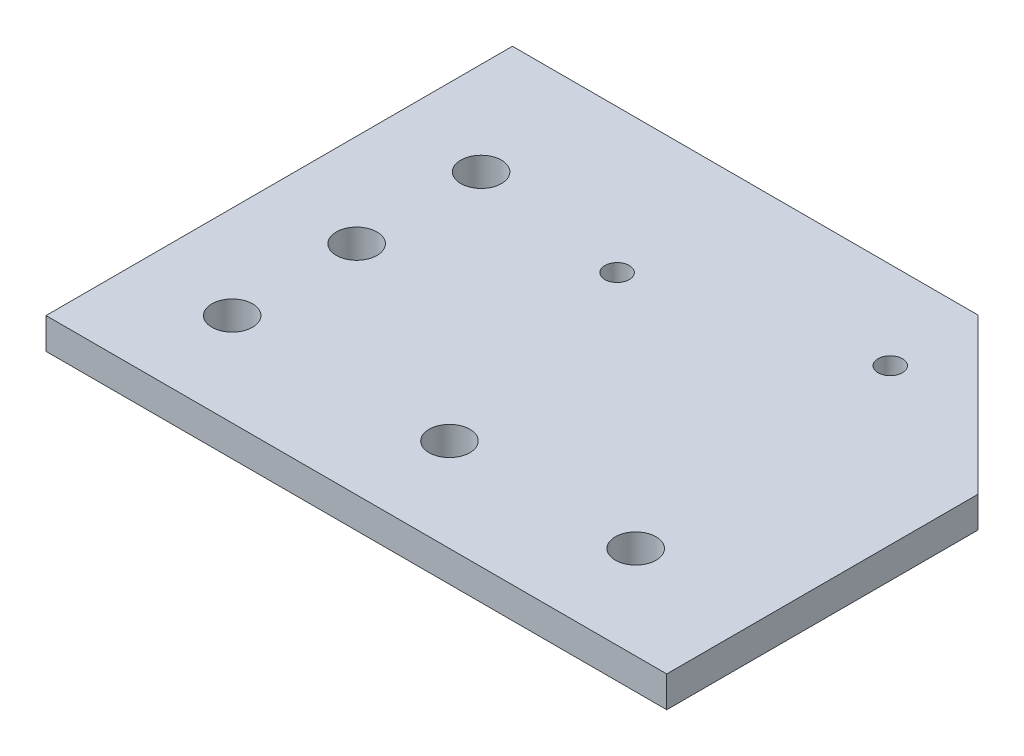
ISO-10303-21;
HEADER;
FILE_DESCRIPTION(('STEP AP214'),'2;1');
FILE_NAME('part.step','',(''),(''),'','','');
FILE_SCHEMA(('AUTOMOTIVE_DESIGN { 1 0 10303 214 1 1 1 1 }'));
ENDSEC;
DATA;
#1=APPLICATION_CONTEXT('core data for automotive mechanical design processes');
#2=APPLICATION_PROTOCOL_DEFINITION('international standard','automotive_design',2000,#1);
#3=PRODUCT_CONTEXT('',#1,'mechanical');
#4=PRODUCT('Part','Part','',(#3));
#5=PRODUCT_RELATED_PRODUCT_CATEGORY('part','',(#4));
#6=PRODUCT_DEFINITION_FORMATION('','',#4);
#7=PRODUCT_DEFINITION_CONTEXT('part definition',#1,'design');
#8=PRODUCT_DEFINITION('design','',#6,#7);
#9=PRODUCT_DEFINITION_SHAPE('','',#8);
#10=(LENGTH_UNIT() NAMED_UNIT(*) SI_UNIT(.MILLI.,.METRE.));
#11=(NAMED_UNIT(*) PLANE_ANGLE_UNIT() SI_UNIT($,.RADIAN.));
#12=(NAMED_UNIT(*) SI_UNIT($,.STERADIAN.) SOLID_ANGLE_UNIT());
#13=UNCERTAINTY_MEASURE_WITH_UNIT(LENGTH_MEASURE(1.E-05),#10,'distance_accuracy_value','');
#14=(GEOMETRIC_REPRESENTATION_CONTEXT(3) GLOBAL_UNCERTAINTY_ASSIGNED_CONTEXT((#13)) GLOBAL_UNIT_ASSIGNED_CONTEXT((#10,
#11,#12)) REPRESENTATION_CONTEXT('',''));
#15=CARTESIAN_POINT('',(0.,0.,0.));
#16=DIRECTION('',(0.,0.,1.));
#17=DIRECTION('',(1.,0.,0.));
#18=AXIS2_PLACEMENT_3D('',#15,#16,#17);
#19=CARTESIAN_POINT('',(-380.909743878932,25.4000000000027,380.909743878929));
#20=DIRECTION('',(0.70710678118655,0.,-0.707106781186545));
#21=DIRECTION('',(-0.707106781186545,0.,-0.70710678118655));
#22=AXIS2_PLACEMENT_3D('',#19,#20,#21);
#23=PLANE('',#22);
#24=DIRECTION('',(0.707106781186545,0.,0.70710678118655));
#25=VECTOR('',#24,1.);
#26=CARTESIAN_POINT('',(-380.909743878932,19.0500000000027,380.909743878929));
#27=LINE('',#26,#25);
#28=CARTESIAN_POINT('',(-381.,19.0500000000027,380.819487757862));
#29=VERTEX_POINT('',#28);
#30=CARTESIAN_POINT('',(-349.25,19.0500000000024,412.569487757861));
#31=VERTEX_POINT('',#30);
#32=EDGE_CURVE('E118',#29,#31,#27,.T.);
#33=ORIENTED_EDGE('',*,*,#32,.F.);
#34=DIRECTION('',(0.,-1.,0.));
#35=VECTOR('',#34,1.);
#36=CARTESIAN_POINT('',(-381.,25.4000000000027,380.819487757862));
#37=LINE('',#36,#35);
#38=CARTESIAN_POINT('',(-381.,25.4000000000027,380.819487757862));
#39=VERTEX_POINT('',#38);
#40=EDGE_CURVE('E11',#39,#29,#37,.T.);
#41=ORIENTED_EDGE('',*,*,#40,.F.);
#42=DIRECTION('',(0.707106781186545,0.,0.70710678118655));
#43=VECTOR('',#42,1.);
#44=CARTESIAN_POINT('',(-380.909743878932,25.4000000000027,380.909743878929));
#45=LINE('',#44,#43);
#46=CARTESIAN_POINT('',(-349.25,25.4000000000024,412.569487757861));
#47=VERTEX_POINT('',#46);
#48=EDGE_CURVE('E158',#39,#47,#45,.T.);
#49=ORIENTED_EDGE('',*,*,#48,.T.);
#50=DIRECTION('',(0.,-1.,0.));
#51=VECTOR('',#50,1.);
#52=CARTESIAN_POINT('',(-349.25,25.4000000000024,412.569487757861));
#53=LINE('',#52,#51);
#54=EDGE_CURVE('E83',#47,#31,#53,.T.);
#55=ORIENTED_EDGE('',*,*,#54,.T.);
#56=EDGE_LOOP('',(#33,#41,#49,#55));
#57=FACE_BOUND('',#56,.T.);
#58=ADVANCED_FACE('F36',(#57),#23,.T.);
#59=CARTESIAN_POINT('',(1.66533453693773E-13,25.4,380.819487757862));
#60=DIRECTION('',(0.,0.,1.));
#61=DIRECTION('',(1.,0.,0.));
#62=AXIS2_PLACEMENT_3D('',#59,#60,#61);
#63=PLANE('',#62);
#64=DIRECTION('',(-1.,0.,0.));
#65=VECTOR('',#64,1.);
#66=CARTESIAN_POINT('',(1.11022302462516E-13,19.05,380.819487757862));
#67=LINE('',#66,#65);
#68=CARTESIAN_POINT('',(-476.25,19.0500000000033,380.819487757862));
#69=VERTEX_POINT('',#68);
#70=EDGE_CURVE('E160',#29,#69,#67,.T.);
#71=ORIENTED_EDGE('',*,*,#70,.T.);
#72=DIRECTION('',(0.,-1.,0.));
#73=VECTOR('',#72,1.);
#74=CARTESIAN_POINT('',(-476.25,25.4000000000033,380.819487757862));
#75=LINE('',#74,#73);
#76=CARTESIAN_POINT('',(-476.25,25.4000000000033,380.819487757862));
#77=VERTEX_POINT('',#76);
#78=EDGE_CURVE('E45',#77,#69,#75,.T.);
#79=ORIENTED_EDGE('',*,*,#78,.F.);
#80=DIRECTION('',(-1.,0.,0.));
#81=VECTOR('',#80,1.);
#82=CARTESIAN_POINT('',(1.66533453693773E-13,25.4,380.819487757862));
#83=LINE('',#82,#81);
#84=EDGE_CURVE('E105',#39,#77,#83,.T.);
#85=ORIENTED_EDGE('',*,*,#84,.F.);
#86=ORIENTED_EDGE('',*,*,#40,.T.);
#87=EDGE_LOOP('',(#71,#79,#85,#86));
#88=FACE_BOUND('',#87,.T.);
#89=ADVANCED_FACE('F171',(#88),#63,.F.);
#90=CARTESIAN_POINT('',(-476.25,25.4000000000033,0.));
#91=DIRECTION('',(1.,0.,0.));
#92=DIRECTION('',(0.,1.,0.));
#93=AXIS2_PLACEMENT_3D('',#90,#91,#92);
#94=PLANE('',#93);
#95=DIRECTION('',(0.,0.,1.));
#96=VECTOR('',#95,1.);
#97=CARTESIAN_POINT('',(-476.25,19.0500000000033,0.));
#98=LINE('',#97,#96);
#99=CARTESIAN_POINT('',(-476.25,19.0500000000033,476.25));
#100=VERTEX_POINT('',#99);
#101=EDGE_CURVE('E72',#69,#100,#98,.T.);
#102=ORIENTED_EDGE('',*,*,#101,.T.);
#103=DIRECTION('',(0.,-1.,0.));
#104=VECTOR('',#103,1.);
#105=CARTESIAN_POINT('',(-476.25,25.4000000000033,476.25));
#106=LINE('',#105,#104);
#107=CARTESIAN_POINT('',(-476.25,25.4000000000033,476.25));
#108=VERTEX_POINT('',#107);
#109=EDGE_CURVE('E96',#108,#100,#106,.T.);
#110=ORIENTED_EDGE('',*,*,#109,.F.);
#111=DIRECTION('',(0.,0.,1.));
#112=VECTOR('',#111,1.);
#113=CARTESIAN_POINT('',(-476.25,25.4000000000033,0.));
#114=LINE('',#113,#112);
#115=EDGE_CURVE('E99',#77,#108,#114,.T.);
#116=ORIENTED_EDGE('',*,*,#115,.F.);
#117=ORIENTED_EDGE('',*,*,#78,.T.);
#118=EDGE_LOOP('',(#102,#110,#116,#117));
#119=FACE_BOUND('',#118,.T.);
#120=ADVANCED_FACE('F109',(#119),#94,.F.);
#121=CARTESIAN_POINT('',(1.66533453693773E-13,25.4,476.25));
#122=DIRECTION('',(0.,0.,-1.));
#123=DIRECTION('',(-1.,0.,0.));
#124=AXIS2_PLACEMENT_3D('',#121,#122,#123);
#125=PLANE('',#124);
#126=DIRECTION('',(1.,0.,0.));
#127=VECTOR('',#126,1.);
#128=CARTESIAN_POINT('',(1.11022302462516E-13,19.05,476.25));
#129=LINE('',#128,#127);
#130=CARTESIAN_POINT('',(-349.25,19.0500000000024,476.25));
#131=VERTEX_POINT('',#130);
#132=EDGE_CURVE('E168',#100,#131,#129,.T.);
#133=ORIENTED_EDGE('',*,*,#132,.T.);
#134=DIRECTION('',(0.,-1.,0.));
#135=VECTOR('',#134,1.);
#136=CARTESIAN_POINT('',(-349.25,25.4000000000024,476.25));
#137=LINE('',#136,#135);
#138=CARTESIAN_POINT('',(-349.25,25.4000000000024,476.25));
#139=VERTEX_POINT('',#138);
#140=EDGE_CURVE('E97',#139,#131,#137,.T.);
#141=ORIENTED_EDGE('',*,*,#140,.F.);
#142=DIRECTION('',(1.,0.,0.));
#143=VECTOR('',#142,1.);
#144=CARTESIAN_POINT('',(1.66533453693773E-13,25.4,476.25));
#145=LINE('',#144,#143);
#146=EDGE_CURVE('E91',#108,#139,#145,.T.);
#147=ORIENTED_EDGE('',*,*,#146,.F.);
#148=ORIENTED_EDGE('',*,*,#109,.T.);
#149=EDGE_LOOP('',(#133,#141,#147,#148));
#150=FACE_BOUND('',#149,.T.);
#151=ADVANCED_FACE('F94',(#150),#125,.F.);
#152=CARTESIAN_POINT('',(-349.25,25.4000000000024,0.));
#153=DIRECTION('',(1.,0.,0.));
#154=DIRECTION('',(0.,1.,0.));
#155=AXIS2_PLACEMENT_3D('',#152,#153,#154);
#156=PLANE('',#155);
#157=DIRECTION('',(0.,0.,1.));
#158=VECTOR('',#157,1.);
#159=CARTESIAN_POINT('',(-349.25,19.0500000000024,0.));
#160=LINE('',#159,#158);
#161=EDGE_CURVE('E165',#31,#131,#160,.T.);
#162=ORIENTED_EDGE('',*,*,#161,.F.);
#163=ORIENTED_EDGE('',*,*,#54,.F.);
#164=DIRECTION('',(0.,0.,1.));
#165=VECTOR('',#164,1.);
#166=CARTESIAN_POINT('',(-349.25,25.4000000000024,0.));
#167=LINE('',#166,#165);
#168=EDGE_CURVE('E100',#47,#139,#167,.T.);
#169=ORIENTED_EDGE('',*,*,#168,.T.);
#170=ORIENTED_EDGE('',*,*,#140,.T.);
#171=EDGE_LOOP('',(#162,#163,#169,#170));
#172=FACE_BOUND('',#171,.T.);
#173=ADVANCED_FACE('F173',(#172),#156,.T.);
#174=CARTESIAN_POINT('',(1.66533453693773E-13,25.4,0.));
#175=DIRECTION('',(0.,-1.,0.));
#176=DIRECTION('',(1.,0.,0.));
#177=AXIS2_PLACEMENT_3D('',#174,#175,#176);
#178=PLANE('',#177);
#179=CARTESIAN_POINT('',(-381.,25.4000000000033,398.78));
#180=DIRECTION('',(0.,1.,0.));
#181=DIRECTION('',(0.,0.,1.));
#182=AXIS2_PLACEMENT_3D('',#179,#180,#181);
#183=CIRCLE('',#182,2.50000000000002);
#184=CARTESIAN_POINT('',(-381.,25.4000000000033,401.28));
#185=VERTEX_POINT('',#184);
#186=EDGE_CURVE('E147',#185,#185,#183,.T.);
#187=ORIENTED_EDGE('',*,*,#186,.F.);
#188=EDGE_LOOP('',(#187));
#189=FACE_BOUND('',#188,.T.);
#190=CARTESIAN_POINT('',(-425.45,25.4000000000033,410.21));
#191=DIRECTION('',(0.,1.,0.));
#192=DIRECTION('',(0.,0.,1.));
#193=AXIS2_PLACEMENT_3D('',#190,#191,#192);
#194=CIRCLE('',#193,2.50000000000002);
#195=CARTESIAN_POINT('',(-425.45,25.4000000000033,412.71));
#196=VERTEX_POINT('',#195);
#197=EDGE_CURVE('E137',#196,#196,#194,.T.);
#198=ORIENTED_EDGE('',*,*,#197,.F.);
#199=EDGE_LOOP('',(#198));
#200=FACE_BOUND('',#199,.T.);
#201=CARTESIAN_POINT('',(-374.65,25.4000000000033,457.2));
#202=DIRECTION('',(0.,1.,0.));
#203=DIRECTION('',(0.,0.,1.));
#204=AXIS2_PLACEMENT_3D('',#201,#202,#203);
#205=CIRCLE('',#204,4.16559999999997);
#206=CARTESIAN_POINT('',(-374.65,25.4000000000033,461.3656));
#207=VERTEX_POINT('',#206);
#208=EDGE_CURVE('E134',#207,#207,#205,.T.);
#209=ORIENTED_EDGE('',*,*,#208,.F.);
#210=EDGE_LOOP('',(#209));
#211=FACE_BOUND('',#210,.T.);
#212=CARTESIAN_POINT('',(-412.75,25.4000000000033,457.2));
#213=DIRECTION('',(0.,1.,0.));
#214=DIRECTION('',(0.,0.,1.));
#215=AXIS2_PLACEMENT_3D('',#212,#213,#214);
#216=CIRCLE('',#215,4.16559999999997);
#217=CARTESIAN_POINT('',(-412.75,25.4000000000033,461.3656));
#218=VERTEX_POINT('',#217);
#219=EDGE_CURVE('E131',#218,#218,#216,.T.);
#220=ORIENTED_EDGE('',*,*,#219,.F.);
#221=EDGE_LOOP('',(#220));
#222=FACE_BOUND('',#221,.T.);
#223=CARTESIAN_POINT('',(-457.2,25.4000000000033,457.2));
#224=DIRECTION('',(0.,1.,0.));
#225=DIRECTION('',(0.,0.,1.));
#226=AXIS2_PLACEMENT_3D('',#223,#224,#225);
#227=CIRCLE('',#226,4.16559999999997);
#228=CARTESIAN_POINT('',(-457.2,25.4000000000033,461.3656));
#229=VERTEX_POINT('',#228);
#230=EDGE_CURVE('E127',#229,#229,#227,.T.);
#231=ORIENTED_EDGE('',*,*,#230,.F.);
#232=EDGE_LOOP('',(#231));
#233=FACE_BOUND('',#232,.T.);
#234=CARTESIAN_POINT('',(-457.2,25.4000000000033,431.73982925262));
#235=DIRECTION('',(0.,1.,0.));
#236=DIRECTION('',(0.,0.,1.));
#237=AXIS2_PLACEMENT_3D('',#234,#235,#236);
#238=CIRCLE('',#237,4.16559999999997);
#239=CARTESIAN_POINT('',(-457.2,25.4000000000033,435.90542925262));
#240=VERTEX_POINT('',#239);
#241=EDGE_CURVE('E123',#240,#240,#238,.T.);
#242=ORIENTED_EDGE('',*,*,#241,.F.);
#243=EDGE_LOOP('',(#242));
#244=FACE_BOUND('',#243,.T.);
#245=CARTESIAN_POINT('',(-457.2,25.4000000000033,406.279658505241));
#246=DIRECTION('',(0.,1.,0.));
#247=DIRECTION('',(0.,0.,1.));
#248=AXIS2_PLACEMENT_3D('',#245,#246,#247);
#249=CIRCLE('',#248,4.16559999999997);
#250=CARTESIAN_POINT('',(-457.2,25.4000000000033,410.445258505241));
#251=VERTEX_POINT('',#250);
#252=EDGE_CURVE('E119',#251,#251,#249,.T.);
#253=ORIENTED_EDGE('',*,*,#252,.F.);
#254=EDGE_LOOP('',(#253));
#255=FACE_BOUND('',#254,.T.);
#256=ORIENTED_EDGE('',*,*,#48,.F.);
#257=ORIENTED_EDGE('',*,*,#84,.T.);
#258=ORIENTED_EDGE('',*,*,#115,.T.);
#259=ORIENTED_EDGE('',*,*,#146,.T.);
#260=ORIENTED_EDGE('',*,*,#168,.F.);
#261=EDGE_LOOP('',(#256,#257,#258,#259,#260));
#262=FACE_BOUND('',#261,.T.);
#263=ADVANCED_FACE('F104',(#189,#200,#211,#222,#233,#244,#255,#262),#178,.F.);
#264=CARTESIAN_POINT('',(1.11022302462516E-13,19.05,0.));
#265=DIRECTION('',(0.,-1.,0.));
#266=DIRECTION('',(1.,0.,0.));
#267=AXIS2_PLACEMENT_3D('',#264,#265,#266);
#268=PLANE('',#267);
#269=CARTESIAN_POINT('',(-381.,19.0500000000027,398.78));
#270=DIRECTION('',(0.,-1.,0.));
#271=DIRECTION('',(1.,0.,0.));
#272=AXIS2_PLACEMENT_3D('',#269,#270,#271);
#273=CIRCLE('',#272,2.50000000000002);
#274=CARTESIAN_POINT('',(-378.5,19.0500000000026,398.78));
#275=VERTEX_POINT('',#274);
#276=EDGE_CURVE('E39',#275,#275,#273,.F.);
#277=ORIENTED_EDGE('',*,*,#276,.T.);
#278=EDGE_LOOP('',(#277));
#279=FACE_BOUND('',#278,.T.);
#280=CARTESIAN_POINT('',(-425.45,19.050000000003,410.21));
#281=DIRECTION('',(0.,-1.,0.));
#282=DIRECTION('',(1.,0.,0.));
#283=AXIS2_PLACEMENT_3D('',#280,#281,#282);
#284=CIRCLE('',#283,2.50000000000002);
#285=CARTESIAN_POINT('',(-422.95,19.050000000003,410.21));
#286=VERTEX_POINT('',#285);
#287=EDGE_CURVE('E135',#286,#286,#284,.F.);
#288=ORIENTED_EDGE('',*,*,#287,.T.);
#289=EDGE_LOOP('',(#288));
#290=FACE_BOUND('',#289,.T.);
#291=CARTESIAN_POINT('',(-374.65,19.0500000000026,457.2));
#292=DIRECTION('',(0.,-1.,0.));
#293=DIRECTION('',(1.,0.,0.));
#294=AXIS2_PLACEMENT_3D('',#291,#292,#293);
#295=CIRCLE('',#294,4.16559999999997);
#296=CARTESIAN_POINT('',(-370.4844,19.0500000000026,457.2));
#297=VERTEX_POINT('',#296);
#298=EDGE_CURVE('E132',#297,#297,#295,.F.);
#299=ORIENTED_EDGE('',*,*,#298,.T.);
#300=EDGE_LOOP('',(#299));
#301=FACE_BOUND('',#300,.T.);
#302=CARTESIAN_POINT('',(-412.75,19.0500000000029,457.2));
#303=DIRECTION('',(0.,-1.,0.));
#304=DIRECTION('',(1.,0.,0.));
#305=AXIS2_PLACEMENT_3D('',#302,#303,#304);
#306=CIRCLE('',#305,4.16559999999997);
#307=CARTESIAN_POINT('',(-408.5844,19.0500000000029,457.2));
#308=VERTEX_POINT('',#307);
#309=EDGE_CURVE('E128',#308,#308,#306,.F.);
#310=ORIENTED_EDGE('',*,*,#309,.T.);
#311=EDGE_LOOP('',(#310));
#312=FACE_BOUND('',#311,.T.);
#313=CARTESIAN_POINT('',(-457.2,19.0500000000032,457.2));
#314=DIRECTION('',(0.,-1.,0.));
#315=DIRECTION('',(1.,0.,0.));
#316=AXIS2_PLACEMENT_3D('',#313,#314,#315);
#317=CIRCLE('',#316,4.16559999999997);
#318=CARTESIAN_POINT('',(-453.0344,19.0500000000032,457.2));
#319=VERTEX_POINT('',#318);
#320=EDGE_CURVE('E124',#319,#319,#317,.F.);
#321=ORIENTED_EDGE('',*,*,#320,.T.);
#322=EDGE_LOOP('',(#321));
#323=FACE_BOUND('',#322,.T.);
#324=CARTESIAN_POINT('',(-457.2,19.0500000000032,431.73982925262));
#325=DIRECTION('',(0.,-1.,0.));
#326=DIRECTION('',(1.,0.,0.));
#327=AXIS2_PLACEMENT_3D('',#324,#325,#326);
#328=CIRCLE('',#327,4.16559999999997);
#329=CARTESIAN_POINT('',(-453.0344,19.0500000000032,431.73982925262));
#330=VERTEX_POINT('',#329);
#331=EDGE_CURVE('E120',#330,#330,#328,.F.);
#332=ORIENTED_EDGE('',*,*,#331,.T.);
#333=EDGE_LOOP('',(#332));
#334=FACE_BOUND('',#333,.T.);
#335=CARTESIAN_POINT('',(-457.2,19.0500000000032,406.279658505241));
#336=DIRECTION('',(0.,-1.,0.));
#337=DIRECTION('',(1.,0.,0.));
#338=AXIS2_PLACEMENT_3D('',#335,#336,#337);
#339=CIRCLE('',#338,4.16559999999997);
#340=CARTESIAN_POINT('',(-453.0344,19.0500000000032,406.279658505241));
#341=VERTEX_POINT('',#340);
#342=EDGE_CURVE('E115',#341,#341,#339,.F.);
#343=ORIENTED_EDGE('',*,*,#342,.T.);
#344=EDGE_LOOP('',(#343));
#345=FACE_BOUND('',#344,.T.);
#346=ORIENTED_EDGE('',*,*,#32,.T.);
#347=ORIENTED_EDGE('',*,*,#161,.T.);
#348=ORIENTED_EDGE('',*,*,#132,.F.);
#349=ORIENTED_EDGE('',*,*,#101,.F.);
#350=ORIENTED_EDGE('',*,*,#70,.F.);
#351=EDGE_LOOP('',(#346,#347,#348,#349,#350));
#352=FACE_BOUND('',#351,.T.);
#353=ADVANCED_FACE('F172',(#279,#290,#301,#312,#323,#334,#345,#352),#268,.T.);
#354=CARTESIAN_POINT('',(-457.2,25.4000000000033,406.279658505241));
#355=DIRECTION('',(0.,-1.,0.));
#356=DIRECTION('',(0.,0.,-1.));
#357=AXIS2_PLACEMENT_3D('',#354,#355,#356);
#358=CYLINDRICAL_SURFACE('',#357,4.16559999999997);
#359=ORIENTED_EDGE('',*,*,#342,.F.);
#360=EDGE_LOOP('',(#359));
#361=FACE_BOUND('',#360,.T.);
#362=ORIENTED_EDGE('',*,*,#252,.T.);
#363=EDGE_LOOP('',(#362));
#364=FACE_BOUND('',#363,.T.);
#365=ADVANCED_FACE('F193',(#361,#364),#358,.F.);
#366=CARTESIAN_POINT('',(-457.2,25.4000000000033,431.73982925262));
#367=DIRECTION('',(0.,-1.,0.));
#368=DIRECTION('',(0.,0.,-1.));
#369=AXIS2_PLACEMENT_3D('',#366,#367,#368);
#370=CYLINDRICAL_SURFACE('',#369,4.16559999999997);
#371=ORIENTED_EDGE('',*,*,#331,.F.);
#372=EDGE_LOOP('',(#371));
#373=FACE_BOUND('',#372,.T.);
#374=ORIENTED_EDGE('',*,*,#241,.T.);
#375=EDGE_LOOP('',(#374));
#376=FACE_BOUND('',#375,.T.);
#377=ADVANCED_FACE('F198',(#373,#376),#370,.F.);
#378=CARTESIAN_POINT('',(-457.2,25.4000000000033,457.2));
#379=DIRECTION('',(0.,-1.,0.));
#380=DIRECTION('',(0.,0.,-1.));
#381=AXIS2_PLACEMENT_3D('',#378,#379,#380);
#382=CYLINDRICAL_SURFACE('',#381,4.16559999999997);
#383=ORIENTED_EDGE('',*,*,#320,.F.);
#384=EDGE_LOOP('',(#383));
#385=FACE_BOUND('',#384,.T.);
#386=ORIENTED_EDGE('',*,*,#230,.T.);
#387=EDGE_LOOP('',(#386));
#388=FACE_BOUND('',#387,.T.);
#389=ADVANCED_FACE('F202',(#385,#388),#382,.F.);
#390=CARTESIAN_POINT('',(-412.75,25.4000000000033,457.2));
#391=DIRECTION('',(0.,-1.,0.));
#392=DIRECTION('',(0.,0.,-1.));
#393=AXIS2_PLACEMENT_3D('',#390,#391,#392);
#394=CYLINDRICAL_SURFACE('',#393,4.16559999999997);
#395=ORIENTED_EDGE('',*,*,#309,.F.);
#396=EDGE_LOOP('',(#395));
#397=FACE_BOUND('',#396,.T.);
#398=ORIENTED_EDGE('',*,*,#219,.T.);
#399=EDGE_LOOP('',(#398));
#400=FACE_BOUND('',#399,.T.);
#401=ADVANCED_FACE('F206',(#397,#400),#394,.F.);
#402=CARTESIAN_POINT('',(-374.65,25.4000000000033,457.2));
#403=DIRECTION('',(0.,-1.,0.));
#404=DIRECTION('',(0.,0.,-1.));
#405=AXIS2_PLACEMENT_3D('',#402,#403,#404);
#406=CYLINDRICAL_SURFACE('',#405,4.16559999999997);
#407=ORIENTED_EDGE('',*,*,#298,.F.);
#408=EDGE_LOOP('',(#407));
#409=FACE_BOUND('',#408,.T.);
#410=ORIENTED_EDGE('',*,*,#208,.T.);
#411=EDGE_LOOP('',(#410));
#412=FACE_BOUND('',#411,.T.);
#413=ADVANCED_FACE('F210',(#409,#412),#406,.F.);
#414=CARTESIAN_POINT('',(-425.45,25.4000000000033,410.21));
#415=DIRECTION('',(0.,-1.,0.));
#416=DIRECTION('',(0.,0.,-1.));
#417=AXIS2_PLACEMENT_3D('',#414,#415,#416);
#418=CYLINDRICAL_SURFACE('',#417,2.50000000000002);
#419=ORIENTED_EDGE('',*,*,#287,.F.);
#420=EDGE_LOOP('',(#419));
#421=FACE_BOUND('',#420,.T.);
#422=ORIENTED_EDGE('',*,*,#197,.T.);
#423=EDGE_LOOP('',(#422));
#424=FACE_BOUND('',#423,.T.);
#425=ADVANCED_FACE('F214',(#421,#424),#418,.F.);
#426=CARTESIAN_POINT('',(-381.,25.4000000000033,398.78));
#427=DIRECTION('',(0.,-1.,0.));
#428=DIRECTION('',(0.,0.,-1.));
#429=AXIS2_PLACEMENT_3D('',#426,#427,#428);
#430=CYLINDRICAL_SURFACE('',#429,2.50000000000002);
#431=ORIENTED_EDGE('',*,*,#276,.F.);
#432=EDGE_LOOP('',(#431));
#433=FACE_BOUND('',#432,.T.);
#434=ORIENTED_EDGE('',*,*,#186,.T.);
#435=EDGE_LOOP('',(#434));
#436=FACE_BOUND('',#435,.T.);
#437=ADVANCED_FACE('F218',(#433,#436),#430,.F.);
#438=CLOSED_SHELL('',(#58,#89,#120,#151,#173,#263,#353,#365,#377,#389,#401,#413,#425,#437));
#439=MANIFOLD_SOLID_BREP('B2',#438);
#440=ADVANCED_BREP_SHAPE_REPRESENTATION('',(#18,#439),#14);
#441=SHAPE_DEFINITION_REPRESENTATION(#9,#440);
ENDSEC;
END-ISO-10303-21;
